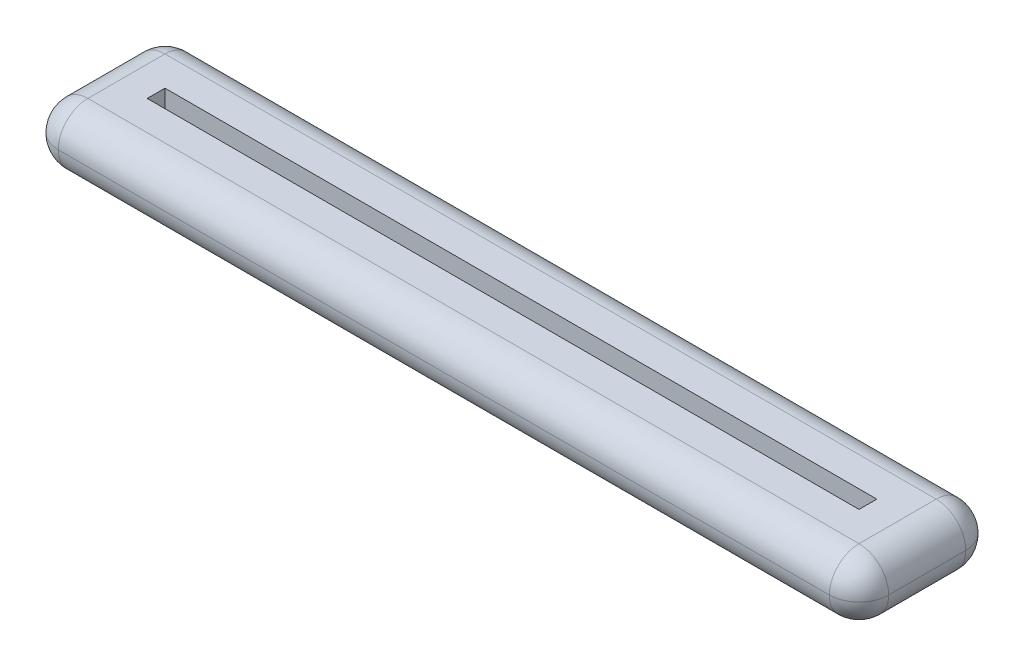
ISO-10303-21;
HEADER;
FILE_DESCRIPTION(('STEP AP214'),'2;1');
FILE_NAME('part.step','',(''),(''),'','','');
FILE_SCHEMA(('AUTOMOTIVE_DESIGN { 1 0 10303 214 1 1 1 1 }'));
ENDSEC;
DATA;
#1=APPLICATION_CONTEXT('core data for automotive mechanical design processes');
#2=APPLICATION_PROTOCOL_DEFINITION('international standard','automotive_design',2000,#1);
#3=PRODUCT_CONTEXT('',#1,'mechanical');
#4=PRODUCT('Part','Part','',(#3));
#5=PRODUCT_RELATED_PRODUCT_CATEGORY('part','',(#4));
#6=PRODUCT_DEFINITION_FORMATION('','',#4);
#7=PRODUCT_DEFINITION_CONTEXT('part definition',#1,'design');
#8=PRODUCT_DEFINITION('design','',#6,#7);
#9=PRODUCT_DEFINITION_SHAPE('','',#8);
#10=(LENGTH_UNIT() NAMED_UNIT(*) SI_UNIT(.MILLI.,.METRE.));
#11=(NAMED_UNIT(*) PLANE_ANGLE_UNIT() SI_UNIT($,.RADIAN.));
#12=(NAMED_UNIT(*) SI_UNIT($,.STERADIAN.) SOLID_ANGLE_UNIT());
#13=UNCERTAINTY_MEASURE_WITH_UNIT(LENGTH_MEASURE(1.E-05),#10,'distance_accuracy_value','');
#14=(GEOMETRIC_REPRESENTATION_CONTEXT(3) GLOBAL_UNCERTAINTY_ASSIGNED_CONTEXT((#13)) GLOBAL_UNIT_ASSIGNED_CONTEXT((#10,
#11,#12)) REPRESENTATION_CONTEXT('',''));
#15=CARTESIAN_POINT('',(0.,0.,0.));
#16=DIRECTION('',(0.,0.,1.));
#17=DIRECTION('',(1.,0.,0.));
#18=AXIS2_PLACEMENT_3D('',#15,#16,#17);
#19=CARTESIAN_POINT('',(0.,5.,0.));
#20=DIRECTION('',(0.,-1.,0.));
#21=DIRECTION('',(0.,0.,-1.));
#22=AXIS2_PLACEMENT_3D('',#19,#20,#21);
#23=PLANE('',#22);
#24=DIRECTION('',(-1.,0.,0.));
#25=VECTOR('',#24,1.);
#26=CARTESIAN_POINT('',(0.,5.,-3.25));
#27=LINE('',#26,#25);
#28=CARTESIAN_POINT('',(32.5,5.,-3.25));
#29=VERTEX_POINT('',#28);
#30=CARTESIAN_POINT('',(-32.5,5.,-3.25));
#31=VERTEX_POINT('',#30);
#32=EDGE_CURVE('E234',#29,#31,#27,.T.);
#33=ORIENTED_EDGE('',*,*,#32,.T.);
#34=DIRECTION('',(0.,0.,1.));
#35=VECTOR('',#34,1.);
#36=CARTESIAN_POINT('',(-32.5,5.,0.));
#37=LINE('',#36,#35);
#38=CARTESIAN_POINT('',(-32.5,5.,3.25));
#39=VERTEX_POINT('',#38);
#40=EDGE_CURVE('E133',#31,#39,#37,.T.);
#41=ORIENTED_EDGE('',*,*,#40,.T.);
#42=DIRECTION('',(1.,0.,0.));
#43=VECTOR('',#42,1.);
#44=CARTESIAN_POINT('',(0.,5.,3.25));
#45=LINE('',#44,#43);
#46=CARTESIAN_POINT('',(32.5,5.,3.25));
#47=VERTEX_POINT('',#46);
#48=EDGE_CURVE('E238',#39,#47,#45,.T.);
#49=ORIENTED_EDGE('',*,*,#48,.T.);
#50=DIRECTION('',(0.,0.,-1.));
#51=VECTOR('',#50,1.);
#52=CARTESIAN_POINT('',(32.5,5.,0.));
#53=LINE('',#52,#51);
#54=EDGE_CURVE('E236',#47,#29,#53,.T.);
#55=ORIENTED_EDGE('',*,*,#54,.T.);
#56=EDGE_LOOP('',(#33,#41,#49,#55));
#57=FACE_BOUND('',#56,.T.);
#58=DIRECTION('',(0.,0.,-1.));
#59=VECTOR('',#58,1.);
#60=CARTESIAN_POINT('',(30.,5.,0.749999999999998));
#61=LINE('',#60,#59);
#62=CARTESIAN_POINT('',(30.,5.,0.749999999999998));
#63=VERTEX_POINT('',#62);
#64=CARTESIAN_POINT('',(30.,5.,-0.750000000000002));
#65=VERTEX_POINT('',#64);
#66=EDGE_CURVE('E224',#63,#65,#61,.T.);
#67=ORIENTED_EDGE('',*,*,#66,.F.);
#68=DIRECTION('',(1.,0.,0.));
#69=VECTOR('',#68,1.);
#70=CARTESIAN_POINT('',(-30.,5.,0.749999999999998));
#71=LINE('',#70,#69);
#72=CARTESIAN_POINT('',(-30.,5.,0.749999999999998));
#73=VERTEX_POINT('',#72);
#74=EDGE_CURVE('E217',#73,#63,#71,.T.);
#75=ORIENTED_EDGE('',*,*,#74,.F.);
#76=DIRECTION('',(0.,0.,1.));
#77=VECTOR('',#76,1.);
#78=CARTESIAN_POINT('',(-30.,5.,0.749999999999998));
#79=LINE('',#78,#77);
#80=CARTESIAN_POINT('',(-30.,5.,-0.750000000000002));
#81=VERTEX_POINT('',#80);
#82=EDGE_CURVE('E468',#81,#73,#79,.T.);
#83=ORIENTED_EDGE('',*,*,#82,.F.);
#84=DIRECTION('',(-1.,0.,0.));
#85=VECTOR('',#84,1.);
#86=CARTESIAN_POINT('',(-30.,5.,-0.750000000000002));
#87=LINE('',#86,#85);
#88=EDGE_CURVE('E470',#65,#81,#87,.T.);
#89=ORIENTED_EDGE('',*,*,#88,.F.);
#90=EDGE_LOOP('',(#67,#75,#83,#89));
#91=FACE_BOUND('',#90,.T.);
#92=ADVANCED_FACE('F33',(#57,#91),#23,.F.);
#93=CARTESIAN_POINT('',(0.,0.,0.));
#94=DIRECTION('',(0.,-1.,0.));
#95=DIRECTION('',(0.,0.,-1.));
#96=AXIS2_PLACEMENT_3D('',#93,#94,#95);
#97=PLANE('',#96);
#98=DIRECTION('',(-1.,0.,0.));
#99=VECTOR('',#98,1.);
#100=CARTESIAN_POINT('',(35.,0.,-3.25));
#101=LINE('',#100,#99);
#102=CARTESIAN_POINT('',(-32.5,0.,-3.25));
#103=VERTEX_POINT('',#102);
#104=CARTESIAN_POINT('',(32.5,0.,-3.25));
#105=VERTEX_POINT('',#104);
#106=EDGE_CURVE('E43',#103,#105,#101,.F.);
#107=ORIENTED_EDGE('',*,*,#106,.T.);
#108=DIRECTION('',(0.,0.,-1.));
#109=VECTOR('',#108,1.);
#110=CARTESIAN_POINT('',(32.5,0.,5.75));
#111=LINE('',#110,#109);
#112=CARTESIAN_POINT('',(32.5,0.,3.25));
#113=VERTEX_POINT('',#112);
#114=EDGE_CURVE('E11',#105,#113,#111,.F.);
#115=ORIENTED_EDGE('',*,*,#114,.T.);
#116=DIRECTION('',(1.,0.,0.));
#117=VECTOR('',#116,1.);
#118=CARTESIAN_POINT('',(-35.,0.,3.25));
#119=LINE('',#118,#117);
#120=CARTESIAN_POINT('',(-32.5,0.,3.25));
#121=VERTEX_POINT('',#120);
#122=EDGE_CURVE('E123',#113,#121,#119,.F.);
#123=ORIENTED_EDGE('',*,*,#122,.T.);
#124=DIRECTION('',(0.,0.,1.));
#125=VECTOR('',#124,1.);
#126=CARTESIAN_POINT('',(-32.5,0.,-5.75));
#127=LINE('',#126,#125);
#128=EDGE_CURVE('E127',#121,#103,#127,.F.);
#129=ORIENTED_EDGE('',*,*,#128,.T.);
#130=EDGE_LOOP('',(#107,#115,#123,#129));
#131=FACE_BOUND('',#130,.T.);
#132=DIRECTION('',(1.,0.,0.));
#133=VECTOR('',#132,1.);
#134=CARTESIAN_POINT('',(-30.,0.,0.749999999999998));
#135=LINE('',#134,#133);
#136=CARTESIAN_POINT('',(-30.,0.,0.749999999999998));
#137=VERTEX_POINT('',#136);
#138=CARTESIAN_POINT('',(30.,0.,0.749999999999998));
#139=VERTEX_POINT('',#138);
#140=EDGE_CURVE('E222',#137,#139,#135,.T.);
#141=ORIENTED_EDGE('',*,*,#140,.T.);
#142=DIRECTION('',(0.,0.,-1.));
#143=VECTOR('',#142,1.);
#144=CARTESIAN_POINT('',(30.,0.,0.749999999999998));
#145=LINE('',#144,#143);
#146=CARTESIAN_POINT('',(30.,0.,-0.750000000000002));
#147=VERTEX_POINT('',#146);
#148=EDGE_CURVE('E210',#139,#147,#145,.T.);
#149=ORIENTED_EDGE('',*,*,#148,.T.);
#150=DIRECTION('',(-1.,0.,0.));
#151=VECTOR('',#150,1.);
#152=CARTESIAN_POINT('',(-30.,0.,-0.750000000000002));
#153=LINE('',#152,#151);
#154=CARTESIAN_POINT('',(-30.,0.,-0.750000000000002));
#155=VERTEX_POINT('',#154);
#156=EDGE_CURVE('E91',#147,#155,#153,.T.);
#157=ORIENTED_EDGE('',*,*,#156,.T.);
#158=DIRECTION('',(0.,0.,1.));
#159=VECTOR('',#158,1.);
#160=CARTESIAN_POINT('',(-30.,0.,0.749999999999998));
#161=LINE('',#160,#159);
#162=EDGE_CURVE('E214',#155,#137,#161,.T.);
#163=ORIENTED_EDGE('',*,*,#162,.T.);
#164=EDGE_LOOP('',(#141,#149,#157,#163));
#165=FACE_BOUND('',#164,.T.);
#166=ADVANCED_FACE('F125',(#131,#165),#97,.T.);
#167=CARTESIAN_POINT('',(30.,5.,0.749999999999998));
#168=DIRECTION('',(-1.,0.,0.));
#169=DIRECTION('',(0.,0.,1.));
#170=AXIS2_PLACEMENT_3D('',#167,#168,#169);
#171=PLANE('',#170);
#172=ORIENTED_EDGE('',*,*,#148,.F.);
#173=DIRECTION('',(0.,-1.,0.));
#174=VECTOR('',#173,1.);
#175=CARTESIAN_POINT('',(30.,5.,0.749999999999998));
#176=LINE('',#175,#174);
#177=EDGE_CURVE('E225',#63,#139,#176,.T.);
#178=ORIENTED_EDGE('',*,*,#177,.F.);
#179=ORIENTED_EDGE('',*,*,#66,.T.);
#180=DIRECTION('',(0.,-1.,0.));
#181=VECTOR('',#180,1.);
#182=CARTESIAN_POINT('',(30.,5.,-0.750000000000002));
#183=LINE('',#182,#181);
#184=EDGE_CURVE('E232',#65,#147,#183,.T.);
#185=ORIENTED_EDGE('',*,*,#184,.T.);
#186=EDGE_LOOP('',(#172,#178,#179,#185));
#187=FACE_BOUND('',#186,.T.);
#188=ADVANCED_FACE('F283',(#187),#171,.T.);
#189=CARTESIAN_POINT('',(-30.,5.,-0.750000000000002));
#190=DIRECTION('',(0.,0.,1.));
#191=DIRECTION('',(1.,0.,0.));
#192=AXIS2_PLACEMENT_3D('',#189,#190,#191);
#193=PLANE('',#192);
#194=ORIENTED_EDGE('',*,*,#156,.F.);
#195=ORIENTED_EDGE('',*,*,#184,.F.);
#196=ORIENTED_EDGE('',*,*,#88,.T.);
#197=DIRECTION('',(0.,-1.,0.));
#198=VECTOR('',#197,1.);
#199=CARTESIAN_POINT('',(-30.,5.,-0.750000000000002));
#200=LINE('',#199,#198);
#201=EDGE_CURVE('E230',#81,#155,#200,.T.);
#202=ORIENTED_EDGE('',*,*,#201,.T.);
#203=EDGE_LOOP('',(#194,#195,#196,#202));
#204=FACE_BOUND('',#203,.T.);
#205=ADVANCED_FACE('F420',(#204),#193,.T.);
#206=CARTESIAN_POINT('',(-30.,5.,0.749999999999998));
#207=DIRECTION('',(1.,0.,0.));
#208=DIRECTION('',(0.,0.,-1.));
#209=AXIS2_PLACEMENT_3D('',#206,#207,#208);
#210=PLANE('',#209);
#211=ORIENTED_EDGE('',*,*,#162,.F.);
#212=ORIENTED_EDGE('',*,*,#201,.F.);
#213=ORIENTED_EDGE('',*,*,#82,.T.);
#214=DIRECTION('',(0.,-1.,0.));
#215=VECTOR('',#214,1.);
#216=CARTESIAN_POINT('',(-30.,5.,0.749999999999998));
#217=LINE('',#216,#215);
#218=EDGE_CURVE('E228',#73,#137,#217,.T.);
#219=ORIENTED_EDGE('',*,*,#218,.T.);
#220=EDGE_LOOP('',(#211,#212,#213,#219));
#221=FACE_BOUND('',#220,.T.);
#222=ADVANCED_FACE('F411',(#221),#210,.T.);
#223=CARTESIAN_POINT('',(-30.,5.,0.749999999999998));
#224=DIRECTION('',(0.,0.,-1.));
#225=DIRECTION('',(-1.,0.,0.));
#226=AXIS2_PLACEMENT_3D('',#223,#224,#225);
#227=PLANE('',#226);
#228=ORIENTED_EDGE('',*,*,#140,.F.);
#229=ORIENTED_EDGE('',*,*,#218,.F.);
#230=ORIENTED_EDGE('',*,*,#74,.T.);
#231=ORIENTED_EDGE('',*,*,#177,.T.);
#232=EDGE_LOOP('',(#228,#229,#230,#231));
#233=FACE_BOUND('',#232,.T.);
#234=ADVANCED_FACE('F403',(#233),#227,.T.);
#235=CARTESIAN_POINT('',(32.5,2.5,-3.25));
#236=DIRECTION('',(0.,0.,1.));
#237=DIRECTION('',(1.,0.,0.));
#238=AXIS2_PLACEMENT_3D('',#235,#236,#237);
#239=SPHERICAL_SURFACE('',#238,2.5);
#240=CARTESIAN_POINT('',(32.5,2.5,-3.25));
#241=DIRECTION('',(0.,0.,-1.));
#242=DIRECTION('',(-1.,0.,0.));
#243=AXIS2_PLACEMENT_3D('',#240,#241,#242);
#244=CIRCLE('',#243,2.5);
#245=CARTESIAN_POINT('',(35.,2.5,-3.25));
#246=VERTEX_POINT('',#245);
#247=EDGE_CURVE('E205',#246,#29,#244,.F.);
#248=ORIENTED_EDGE('',*,*,#247,.F.);
#249=CARTESIAN_POINT('',(32.5,2.5,-3.25));
#250=DIRECTION('',(0.,-1.,0.));
#251=DIRECTION('',(0.,0.,-1.));
#252=AXIS2_PLACEMENT_3D('',#249,#250,#251);
#253=CIRCLE('',#252,2.5);
#254=CARTESIAN_POINT('',(32.5,2.5,-5.75));
#255=VERTEX_POINT('',#254);
#256=EDGE_CURVE('E37',#255,#246,#253,.T.);
#257=ORIENTED_EDGE('',*,*,#256,.F.);
#258=CARTESIAN_POINT('',(32.5,2.5,-3.25));
#259=DIRECTION('',(1.,0.,0.));
#260=DIRECTION('',(0.,1.,0.));
#261=AXIS2_PLACEMENT_3D('',#258,#259,#260);
#262=CIRCLE('',#261,2.5);
#263=EDGE_CURVE('E207',#29,#255,#262,.F.);
#264=ORIENTED_EDGE('',*,*,#263,.F.);
#265=EDGE_LOOP('',(#248,#257,#264));
#266=FACE_BOUND('',#265,.T.);
#267=ADVANCED_FACE('F35',(#266),#239,.T.);
#268=CARTESIAN_POINT('',(32.5,2.5,-3.25));
#269=DIRECTION('',(0.,0.,1.));
#270=DIRECTION('',(1.,0.,0.));
#271=AXIS2_PLACEMENT_3D('',#268,#269,#270);
#272=SPHERICAL_SURFACE('',#271,2.5);
#273=CARTESIAN_POINT('',(32.5,2.5,-3.25));
#274=DIRECTION('',(1.,0.,0.));
#275=DIRECTION('',(0.,0.,-1.));
#276=AXIS2_PLACEMENT_3D('',#273,#274,#275);
#277=CIRCLE('',#276,2.5);
#278=EDGE_CURVE('E197',#255,#105,#277,.F.);
#279=ORIENTED_EDGE('',*,*,#278,.F.);
#280=ORIENTED_EDGE('',*,*,#256,.T.);
#281=CARTESIAN_POINT('',(32.5,2.5,-3.25));
#282=DIRECTION('',(0.,0.,-1.));
#283=DIRECTION('',(-1.,0.,0.));
#284=AXIS2_PLACEMENT_3D('',#281,#282,#283);
#285=CIRCLE('',#284,2.5);
#286=EDGE_CURVE('E199',#105,#246,#285,.F.);
#287=ORIENTED_EDGE('',*,*,#286,.F.);
#288=EDGE_LOOP('',(#279,#280,#287));
#289=FACE_BOUND('',#288,.T.);
#290=ADVANCED_FACE('F389',(#289),#272,.T.);
#291=CARTESIAN_POINT('',(0.,2.5,-3.25));
#292=DIRECTION('',(-1.,0.,0.));
#293=DIRECTION('',(0.,0.,1.));
#294=AXIS2_PLACEMENT_3D('',#291,#292,#293);
#295=CYLINDRICAL_SURFACE('',#294,2.5);
#296=ORIENTED_EDGE('',*,*,#32,.F.);
#297=ORIENTED_EDGE('',*,*,#263,.T.);
#298=DIRECTION('',(-1.,0.,0.));
#299=VECTOR('',#298,1.);
#300=CARTESIAN_POINT('',(-35.,2.5,-5.75));
#301=LINE('',#300,#299);
#302=CARTESIAN_POINT('',(-32.5,2.5,-5.75));
#303=VERTEX_POINT('',#302);
#304=EDGE_CURVE('E194',#303,#255,#301,.F.);
#305=ORIENTED_EDGE('',*,*,#304,.F.);
#306=CARTESIAN_POINT('',(-32.5,2.5,-3.25));
#307=DIRECTION('',(-1.,0.,0.));
#308=DIRECTION('',(0.,0.,1.));
#309=AXIS2_PLACEMENT_3D('',#306,#307,#308);
#310=CIRCLE('',#309,2.5);
#311=EDGE_CURVE('E191',#31,#303,#310,.T.);
#312=ORIENTED_EDGE('',*,*,#311,.F.);
#313=EDGE_LOOP('',(#296,#297,#305,#312));
#314=FACE_BOUND('',#313,.T.);
#315=ADVANCED_FACE('F381',(#314),#295,.T.);
#316=CARTESIAN_POINT('',(32.5,2.5,0.));
#317=DIRECTION('',(0.,0.,-1.));
#318=DIRECTION('',(-1.,0.,0.));
#319=AXIS2_PLACEMENT_3D('',#316,#317,#318);
#320=CYLINDRICAL_SURFACE('',#319,2.5);
#321=CARTESIAN_POINT('',(32.5,2.5,3.25));
#322=DIRECTION('',(0.,0.,1.));
#323=DIRECTION('',(1.,0.,0.));
#324=AXIS2_PLACEMENT_3D('',#321,#322,#323);
#325=CIRCLE('',#324,2.5);
#326=CARTESIAN_POINT('',(35.,2.5,3.25));
#327=VERTEX_POINT('',#326);
#328=EDGE_CURVE('E188',#327,#47,#325,.T.);
#329=ORIENTED_EDGE('',*,*,#328,.F.);
#330=DIRECTION('',(0.,0.,-1.));
#331=VECTOR('',#330,1.);
#332=CARTESIAN_POINT('',(35.,2.5,5.75));
#333=LINE('',#332,#331);
#334=EDGE_CURVE('E202',#246,#327,#333,.F.);
#335=ORIENTED_EDGE('',*,*,#334,.F.);
#336=ORIENTED_EDGE('',*,*,#247,.T.);
#337=ORIENTED_EDGE('',*,*,#54,.F.);
#338=EDGE_LOOP('',(#329,#335,#336,#337));
#339=FACE_BOUND('',#338,.T.);
#340=ADVANCED_FACE('F261',(#339),#320,.T.);
#341=CARTESIAN_POINT('',(32.5,2.5,5.75));
#342=DIRECTION('',(0.,0.,1.));
#343=DIRECTION('',(1.,0.,0.));
#344=AXIS2_PLACEMENT_3D('',#341,#342,#343);
#345=CYLINDRICAL_SURFACE('',#344,2.5);
#346=ORIENTED_EDGE('',*,*,#286,.T.);
#347=ORIENTED_EDGE('',*,*,#334,.T.);
#348=CARTESIAN_POINT('',(32.5,2.5,3.25));
#349=DIRECTION('',(0.,0.,1.));
#350=DIRECTION('',(1.,0.,0.));
#351=AXIS2_PLACEMENT_3D('',#348,#349,#350);
#352=CIRCLE('',#351,2.5);
#353=EDGE_CURVE('E183',#113,#327,#352,.T.);
#354=ORIENTED_EDGE('',*,*,#353,.F.);
#355=ORIENTED_EDGE('',*,*,#114,.F.);
#356=EDGE_LOOP('',(#346,#347,#354,#355));
#357=FACE_BOUND('',#356,.T.);
#358=ADVANCED_FACE('F264',(#357),#345,.T.);
#359=CARTESIAN_POINT('',(-35.,2.5,-3.25));
#360=DIRECTION('',(1.,0.,0.));
#361=DIRECTION('',(0.,0.,-1.));
#362=AXIS2_PLACEMENT_3D('',#359,#360,#361);
#363=CYLINDRICAL_SURFACE('',#362,2.5);
#364=CARTESIAN_POINT('',(-32.5,2.5,-3.25));
#365=DIRECTION('',(-1.,0.,0.));
#366=DIRECTION('',(0.,0.,1.));
#367=AXIS2_PLACEMENT_3D('',#364,#365,#366);
#368=CIRCLE('',#367,2.5);
#369=EDGE_CURVE('E180',#303,#103,#368,.T.);
#370=ORIENTED_EDGE('',*,*,#369,.F.);
#371=ORIENTED_EDGE('',*,*,#304,.T.);
#372=ORIENTED_EDGE('',*,*,#278,.T.);
#373=ORIENTED_EDGE('',*,*,#106,.F.);
#374=EDGE_LOOP('',(#370,#371,#372,#373));
#375=FACE_BOUND('',#374,.T.);
#376=ADVANCED_FACE('F357',(#375),#363,.T.);
#377=CARTESIAN_POINT('',(-32.5,2.5,-3.25));
#378=DIRECTION('',(0.,0.,1.));
#379=DIRECTION('',(1.,0.,0.));
#380=AXIS2_PLACEMENT_3D('',#377,#378,#379);
#381=SPHERICAL_SURFACE('',#380,2.5);
#382=ORIENTED_EDGE('',*,*,#311,.T.);
#383=CARTESIAN_POINT('',(-32.5,2.5,-3.25));
#384=DIRECTION('',(0.,-1.,0.));
#385=DIRECTION('',(0.,0.,-1.));
#386=AXIS2_PLACEMENT_3D('',#383,#384,#385);
#387=CIRCLE('',#386,2.5);
#388=CARTESIAN_POINT('',(-35.,2.5,-3.25));
#389=VERTEX_POINT('',#388);
#390=EDGE_CURVE('E177',#389,#303,#387,.T.);
#391=ORIENTED_EDGE('',*,*,#390,.F.);
#392=CARTESIAN_POINT('',(-32.5,2.5,-3.25));
#393=DIRECTION('',(0.,0.,-1.));
#394=DIRECTION('',(0.,1.,0.));
#395=AXIS2_PLACEMENT_3D('',#392,#393,#394);
#396=CIRCLE('',#395,2.5);
#397=EDGE_CURVE('E174',#31,#389,#396,.F.);
#398=ORIENTED_EDGE('',*,*,#397,.F.);
#399=EDGE_LOOP('',(#382,#391,#398));
#400=FACE_BOUND('',#399,.T.);
#401=ADVANCED_FACE('F276',(#400),#381,.T.);
#402=CARTESIAN_POINT('',(32.5,2.5,3.25));
#403=DIRECTION('',(0.,0.,1.));
#404=DIRECTION('',(1.,0.,0.));
#405=AXIS2_PLACEMENT_3D('',#402,#403,#404);
#406=SPHERICAL_SURFACE('',#405,2.5);
#407=CARTESIAN_POINT('',(32.5,2.5,3.25));
#408=DIRECTION('',(0.,1.,0.));
#409=DIRECTION('',(0.,0.,1.));
#410=AXIS2_PLACEMENT_3D('',#407,#408,#409);
#411=CIRCLE('',#410,2.5);
#412=CARTESIAN_POINT('',(32.5,2.5,5.75));
#413=VERTEX_POINT('',#412);
#414=EDGE_CURVE('E186',#413,#327,#411,.T.);
#415=ORIENTED_EDGE('',*,*,#414,.T.);
#416=ORIENTED_EDGE('',*,*,#328,.T.);
#417=CARTESIAN_POINT('',(32.5,2.5,3.25));
#418=DIRECTION('',(1.,0.,0.));
#419=DIRECTION('',(0.,0.,-1.));
#420=AXIS2_PLACEMENT_3D('',#417,#418,#419);
#421=CIRCLE('',#420,2.5);
#422=EDGE_CURVE('E171',#413,#47,#421,.F.);
#423=ORIENTED_EDGE('',*,*,#422,.F.);
#424=EDGE_LOOP('',(#415,#416,#423));
#425=FACE_BOUND('',#424,.T.);
#426=ADVANCED_FACE('F257',(#425),#406,.T.);
#427=CARTESIAN_POINT('',(32.5,2.5,3.25));
#428=DIRECTION('',(0.,0.,1.));
#429=DIRECTION('',(1.,0.,0.));
#430=AXIS2_PLACEMENT_3D('',#427,#428,#429);
#431=SPHERICAL_SURFACE('',#430,2.5);
#432=ORIENTED_EDGE('',*,*,#353,.T.);
#433=ORIENTED_EDGE('',*,*,#414,.F.);
#434=CARTESIAN_POINT('',(32.5,2.5,3.25));
#435=DIRECTION('',(1.,0.,0.));
#436=DIRECTION('',(0.,0.,-1.));
#437=AXIS2_PLACEMENT_3D('',#434,#435,#436);
#438=CIRCLE('',#437,2.5);
#439=EDGE_CURVE('E168',#113,#413,#438,.F.);
#440=ORIENTED_EDGE('',*,*,#439,.F.);
#441=EDGE_LOOP('',(#432,#433,#440));
#442=FACE_BOUND('',#441,.T.);
#443=ADVANCED_FACE('F266',(#442),#431,.T.);
#444=CARTESIAN_POINT('',(-32.5,2.5,-3.25));
#445=DIRECTION('',(0.,0.,1.));
#446=DIRECTION('',(1.,0.,0.));
#447=AXIS2_PLACEMENT_3D('',#444,#445,#446);
#448=SPHERICAL_SURFACE('',#447,2.5);
#449=ORIENTED_EDGE('',*,*,#390,.T.);
#450=ORIENTED_EDGE('',*,*,#369,.T.);
#451=CARTESIAN_POINT('',(-32.5,2.5,-3.25));
#452=DIRECTION('',(0.,0.,-1.));
#453=DIRECTION('',(-1.,0.,0.));
#454=AXIS2_PLACEMENT_3D('',#451,#452,#453);
#455=CIRCLE('',#454,2.5);
#456=EDGE_CURVE('E144',#389,#103,#455,.F.);
#457=ORIENTED_EDGE('',*,*,#456,.F.);
#458=EDGE_LOOP('',(#449,#450,#457));
#459=FACE_BOUND('',#458,.T.);
#460=ADVANCED_FACE('F268',(#459),#448,.T.);
#461=CARTESIAN_POINT('',(-32.5,2.5,0.));
#462=DIRECTION('',(0.,0.,1.));
#463=DIRECTION('',(1.,0.,0.));
#464=AXIS2_PLACEMENT_3D('',#461,#462,#463);
#465=CYLINDRICAL_SURFACE('',#464,2.5);
#466=ORIENTED_EDGE('',*,*,#40,.F.);
#467=ORIENTED_EDGE('',*,*,#397,.T.);
#468=DIRECTION('',(0.,0.,1.));
#469=VECTOR('',#468,1.);
#470=CARTESIAN_POINT('',(-35.,2.5,5.75));
#471=LINE('',#470,#469);
#472=CARTESIAN_POINT('',(-35.,2.5,3.25));
#473=VERTEX_POINT('',#472);
#474=EDGE_CURVE('E165',#473,#389,#471,.F.);
#475=ORIENTED_EDGE('',*,*,#474,.F.);
#476=CARTESIAN_POINT('',(-32.5,2.5,3.25));
#477=DIRECTION('',(0.,0.,1.));
#478=DIRECTION('',(1.,0.,0.));
#479=AXIS2_PLACEMENT_3D('',#476,#477,#478);
#480=CIRCLE('',#479,2.5);
#481=EDGE_CURVE('E162',#39,#473,#480,.T.);
#482=ORIENTED_EDGE('',*,*,#481,.F.);
#483=EDGE_LOOP('',(#466,#467,#475,#482));
#484=FACE_BOUND('',#483,.T.);
#485=ADVANCED_FACE('F250',(#484),#465,.T.);
#486=CARTESIAN_POINT('',(0.,2.5,3.25));
#487=DIRECTION('',(1.,0.,0.));
#488=DIRECTION('',(0.,0.,-1.));
#489=AXIS2_PLACEMENT_3D('',#486,#487,#488);
#490=CYLINDRICAL_SURFACE('',#489,2.5);
#491=DIRECTION('',(1.,0.,0.));
#492=VECTOR('',#491,1.);
#493=CARTESIAN_POINT('',(-35.,2.5,5.75));
#494=LINE('',#493,#492);
#495=CARTESIAN_POINT('',(-32.5,2.5,5.75));
#496=VERTEX_POINT('',#495);
#497=EDGE_CURVE('E150',#413,#496,#494,.F.);
#498=ORIENTED_EDGE('',*,*,#497,.F.);
#499=ORIENTED_EDGE('',*,*,#422,.T.);
#500=ORIENTED_EDGE('',*,*,#48,.F.);
#501=CARTESIAN_POINT('',(-32.5,2.5,3.25));
#502=DIRECTION('',(-1.,0.,0.));
#503=DIRECTION('',(0.,0.,1.));
#504=AXIS2_PLACEMENT_3D('',#501,#502,#503);
#505=CIRCLE('',#504,2.5);
#506=EDGE_CURVE('E154',#496,#39,#505,.T.);
#507=ORIENTED_EDGE('',*,*,#506,.F.);
#508=EDGE_LOOP('',(#498,#499,#500,#507));
#509=FACE_BOUND('',#508,.T.);
#510=ADVANCED_FACE('F254',(#509),#490,.T.);
#511=CARTESIAN_POINT('',(-35.,2.5,3.25));
#512=DIRECTION('',(-1.,0.,0.));
#513=DIRECTION('',(0.,0.,1.));
#514=AXIS2_PLACEMENT_3D('',#511,#512,#513);
#515=CYLINDRICAL_SURFACE('',#514,2.5);
#516=ORIENTED_EDGE('',*,*,#439,.T.);
#517=ORIENTED_EDGE('',*,*,#497,.T.);
#518=CARTESIAN_POINT('',(-32.5,2.5,3.25));
#519=DIRECTION('',(-1.,0.,0.));
#520=DIRECTION('',(0.,0.,1.));
#521=AXIS2_PLACEMENT_3D('',#518,#519,#520);
#522=CIRCLE('',#521,2.5);
#523=EDGE_CURVE('E147',#121,#496,#522,.T.);
#524=ORIENTED_EDGE('',*,*,#523,.F.);
#525=ORIENTED_EDGE('',*,*,#122,.F.);
#526=EDGE_LOOP('',(#516,#517,#524,#525));
#527=FACE_BOUND('',#526,.T.);
#528=ADVANCED_FACE('F148',(#527),#515,.T.);
#529=CARTESIAN_POINT('',(-32.5,2.5,5.75));
#530=DIRECTION('',(0.,0.,-1.));
#531=DIRECTION('',(-1.,0.,0.));
#532=AXIS2_PLACEMENT_3D('',#529,#530,#531);
#533=CYLINDRICAL_SURFACE('',#532,2.5);
#534=ORIENTED_EDGE('',*,*,#456,.T.);
#535=ORIENTED_EDGE('',*,*,#128,.F.);
#536=CARTESIAN_POINT('',(-32.5,2.5,3.25));
#537=DIRECTION('',(0.,0.,1.));
#538=DIRECTION('',(1.,0.,0.));
#539=AXIS2_PLACEMENT_3D('',#536,#537,#538);
#540=CIRCLE('',#539,2.5);
#541=EDGE_CURVE('E141',#473,#121,#540,.T.);
#542=ORIENTED_EDGE('',*,*,#541,.F.);
#543=ORIENTED_EDGE('',*,*,#474,.T.);
#544=EDGE_LOOP('',(#534,#535,#542,#543));
#545=FACE_BOUND('',#544,.T.);
#546=ADVANCED_FACE('F138',(#545),#533,.T.);
#547=CARTESIAN_POINT('',(-32.5,2.5,3.25));
#548=DIRECTION('',(0.,0.,1.));
#549=DIRECTION('',(1.,0.,0.));
#550=AXIS2_PLACEMENT_3D('',#547,#548,#549);
#551=SPHERICAL_SURFACE('',#550,2.5);
#552=ORIENTED_EDGE('',*,*,#506,.T.);
#553=ORIENTED_EDGE('',*,*,#481,.T.);
#554=CARTESIAN_POINT('',(-32.5,2.5,3.25));
#555=DIRECTION('',(0.,1.,0.));
#556=DIRECTION('',(0.,0.,1.));
#557=AXIS2_PLACEMENT_3D('',#554,#555,#556);
#558=CIRCLE('',#557,2.5);
#559=EDGE_CURVE('E157',#496,#473,#558,.F.);
#560=ORIENTED_EDGE('',*,*,#559,.F.);
#561=EDGE_LOOP('',(#552,#553,#560));
#562=FACE_BOUND('',#561,.T.);
#563=ADVANCED_FACE('F290',(#562),#551,.T.);
#564=CARTESIAN_POINT('',(-32.5,2.5,3.25));
#565=DIRECTION('',(0.,0.,1.));
#566=DIRECTION('',(1.,0.,0.));
#567=AXIS2_PLACEMENT_3D('',#564,#565,#566);
#568=SPHERICAL_SURFACE('',#567,2.5);
#569=ORIENTED_EDGE('',*,*,#541,.T.);
#570=ORIENTED_EDGE('',*,*,#523,.T.);
#571=ORIENTED_EDGE('',*,*,#559,.T.);
#572=EDGE_LOOP('',(#569,#570,#571));
#573=FACE_BOUND('',#572,.T.);
#574=ADVANCED_FACE('F156',(#573),#568,.T.);
#575=CLOSED_SHELL('',(#92,#166,#188,#205,#222,#234,#267,#290,#315,#340,#358,#376,#401,#426,#443,
#460,#485,#510,#528,#546,#563,#574));
#576=MANIFOLD_SOLID_BREP('B2',#575);
#577=ADVANCED_BREP_SHAPE_REPRESENTATION('',(#18,#576),#14);
#578=SHAPE_DEFINITION_REPRESENTATION(#9,#577);
ENDSEC;
END-ISO-10303-21;
